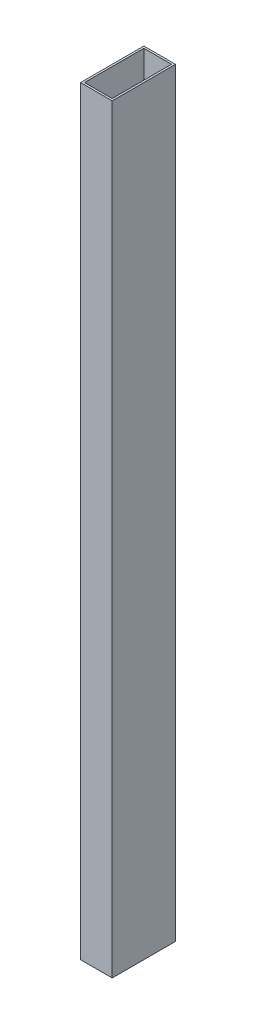
ISO-10303-21;
HEADER;
FILE_DESCRIPTION(('STEP AP214'),'2;1');
FILE_NAME('part.step','',(''),(''),'','','');
FILE_SCHEMA(('AUTOMOTIVE_DESIGN { 1 0 10303 214 1 1 1 1 }'));
ENDSEC;
DATA;
#1=APPLICATION_CONTEXT('core data for automotive mechanical design processes');
#2=APPLICATION_PROTOCOL_DEFINITION('international standard','automotive_design',2000,#1);
#3=PRODUCT_CONTEXT('',#1,'mechanical');
#4=PRODUCT('Part','Part','',(#3));
#5=PRODUCT_RELATED_PRODUCT_CATEGORY('part','',(#4));
#6=PRODUCT_DEFINITION_FORMATION('','',#4);
#7=PRODUCT_DEFINITION_CONTEXT('part definition',#1,'design');
#8=PRODUCT_DEFINITION('design','',#6,#7);
#9=PRODUCT_DEFINITION_SHAPE('','',#8);
#10=(LENGTH_UNIT() NAMED_UNIT(*) SI_UNIT(.MILLI.,.METRE.));
#11=(NAMED_UNIT(*) PLANE_ANGLE_UNIT() SI_UNIT($,.RADIAN.));
#12=(NAMED_UNIT(*) SI_UNIT($,.STERADIAN.) SOLID_ANGLE_UNIT());
#13=UNCERTAINTY_MEASURE_WITH_UNIT(LENGTH_MEASURE(1.E-05),#10,'distance_accuracy_value','');
#14=(GEOMETRIC_REPRESENTATION_CONTEXT(3) GLOBAL_UNCERTAINTY_ASSIGNED_CONTEXT((#13)) GLOBAL_UNIT_ASSIGNED_CONTEXT((#10,
#11,#12)) REPRESENTATION_CONTEXT('',''));
#15=CARTESIAN_POINT('',(0.,0.,0.));
#16=DIRECTION('',(0.,0.,1.));
#17=DIRECTION('',(1.,0.,0.));
#18=AXIS2_PLACEMENT_3D('',#15,#16,#17);
#19=CARTESIAN_POINT('',(0.,609.6,0.));
#20=DIRECTION('',(0.,1.,0.));
#21=DIRECTION('',(0.,0.,1.));
#22=AXIS2_PLACEMENT_3D('',#19,#20,#21);
#23=PLANE('',#22);
#24=DIRECTION('',(0.,0.,1.));
#25=VECTOR('',#24,1.);
#26=CARTESIAN_POINT('',(-12.7,609.6,25.4));
#27=LINE('',#26,#25);
#28=CARTESIAN_POINT('',(-12.7,609.6,-25.4));
#29=VERTEX_POINT('',#28);
#30=CARTESIAN_POINT('',(-12.7,609.6,25.4));
#31=VERTEX_POINT('',#30);
#32=EDGE_CURVE('E153',#29,#31,#27,.T.);
#33=ORIENTED_EDGE('',*,*,#32,.T.);
#34=DIRECTION('',(1.,0.,0.));
#35=VECTOR('',#34,1.);
#36=CARTESIAN_POINT('',(12.7,609.6,25.4));
#37=LINE('',#36,#35);
#38=CARTESIAN_POINT('',(12.7,609.6,25.4));
#39=VERTEX_POINT('',#38);
#40=EDGE_CURVE('E157',#31,#39,#37,.T.);
#41=ORIENTED_EDGE('',*,*,#40,.T.);
#42=DIRECTION('',(0.,0.,-1.));
#43=VECTOR('',#42,1.);
#44=CARTESIAN_POINT('',(12.7,609.6,25.4));
#45=LINE('',#44,#43);
#46=CARTESIAN_POINT('',(12.7,609.6,-25.4));
#47=VERTEX_POINT('',#46);
#48=EDGE_CURVE('E161',#39,#47,#45,.T.);
#49=ORIENTED_EDGE('',*,*,#48,.T.);
#50=DIRECTION('',(-1.,0.,0.));
#51=VECTOR('',#50,1.);
#52=CARTESIAN_POINT('',(12.7,609.6,-25.4));
#53=LINE('',#52,#51);
#54=EDGE_CURVE('E164',#47,#29,#53,.T.);
#55=ORIENTED_EDGE('',*,*,#54,.T.);
#56=EDGE_LOOP('',(#33,#41,#49,#55));
#57=FACE_BOUND('',#56,.T.);
#58=DIRECTION('',(1.,0.,0.));
#59=VECTOR('',#58,1.);
#60=CARTESIAN_POINT('',(11.1125,609.6,23.8125));
#61=LINE('',#60,#59);
#62=CARTESIAN_POINT('',(-11.1125,609.6,23.8125));
#63=VERTEX_POINT('',#62);
#64=CARTESIAN_POINT('',(11.1125,609.6,23.8125));
#65=VERTEX_POINT('',#64);
#66=EDGE_CURVE('E114',#63,#65,#61,.T.);
#67=ORIENTED_EDGE('',*,*,#66,.F.);
#68=DIRECTION('',(0.,0.,1.));
#69=VECTOR('',#68,1.);
#70=CARTESIAN_POINT('',(-11.1125,609.6,23.8125));
#71=LINE('',#70,#69);
#72=CARTESIAN_POINT('',(-11.1125,609.6,-23.8125));
#73=VERTEX_POINT('',#72);
#74=EDGE_CURVE('E105',#73,#63,#71,.T.);
#75=ORIENTED_EDGE('',*,*,#74,.F.);
#76=DIRECTION('',(-1.,0.,0.));
#77=VECTOR('',#76,1.);
#78=CARTESIAN_POINT('',(11.1125,609.6,-23.8125));
#79=LINE('',#78,#77);
#80=CARTESIAN_POINT('',(11.1125,609.6,-23.8125));
#81=VERTEX_POINT('',#80);
#82=EDGE_CURVE('E131',#81,#73,#79,.T.);
#83=ORIENTED_EDGE('',*,*,#82,.F.);
#84=DIRECTION('',(0.,0.,-1.));
#85=VECTOR('',#84,1.);
#86=CARTESIAN_POINT('',(11.1125,609.6,23.8125));
#87=LINE('',#86,#85);
#88=EDGE_CURVE('E127',#65,#81,#87,.T.);
#89=ORIENTED_EDGE('',*,*,#88,.F.);
#90=EDGE_LOOP('',(#67,#75,#83,#89));
#91=FACE_BOUND('',#90,.T.);
#92=ADVANCED_FACE('F39',(#57,#91),#23,.T.);
#93=CARTESIAN_POINT('',(0.,0.,0.));
#94=DIRECTION('',(0.,1.,0.));
#95=DIRECTION('',(0.,0.,1.));
#96=AXIS2_PLACEMENT_3D('',#93,#94,#95);
#97=PLANE('',#96);
#98=DIRECTION('',(0.,0.,1.));
#99=VECTOR('',#98,1.);
#100=CARTESIAN_POINT('',(-12.7,0.,25.4));
#101=LINE('',#100,#99);
#102=CARTESIAN_POINT('',(-12.7,0.,-25.4));
#103=VERTEX_POINT('',#102);
#104=CARTESIAN_POINT('',(-12.7,0.,25.4));
#105=VERTEX_POINT('',#104);
#106=EDGE_CURVE('E123',#103,#105,#101,.T.);
#107=ORIENTED_EDGE('',*,*,#106,.F.);
#108=DIRECTION('',(-1.,0.,0.));
#109=VECTOR('',#108,1.);
#110=CARTESIAN_POINT('',(12.7,0.,-25.4));
#111=LINE('',#110,#109);
#112=CARTESIAN_POINT('',(12.7,0.,-25.4));
#113=VERTEX_POINT('',#112);
#114=EDGE_CURVE('E158',#113,#103,#111,.T.);
#115=ORIENTED_EDGE('',*,*,#114,.F.);
#116=DIRECTION('',(0.,0.,-1.));
#117=VECTOR('',#116,1.);
#118=CARTESIAN_POINT('',(12.7,0.,25.4));
#119=LINE('',#118,#117);
#120=CARTESIAN_POINT('',(12.7,0.,25.4));
#121=VERTEX_POINT('',#120);
#122=EDGE_CURVE('E174',#121,#113,#119,.T.);
#123=ORIENTED_EDGE('',*,*,#122,.F.);
#124=DIRECTION('',(1.,0.,0.));
#125=VECTOR('',#124,1.);
#126=CARTESIAN_POINT('',(12.7,0.,25.4));
#127=LINE('',#126,#125);
#128=EDGE_CURVE('E171',#105,#121,#127,.T.);
#129=ORIENTED_EDGE('',*,*,#128,.F.);
#130=EDGE_LOOP('',(#107,#115,#123,#129));
#131=FACE_BOUND('',#130,.T.);
#132=DIRECTION('',(0.,0.,1.));
#133=VECTOR('',#132,1.);
#134=CARTESIAN_POINT('',(-11.1125,0.,23.8125));
#135=LINE('',#134,#133);
#136=CARTESIAN_POINT('',(-11.1125,0.,-23.8125));
#137=VERTEX_POINT('',#136);
#138=CARTESIAN_POINT('',(-11.1125,0.,23.8125));
#139=VERTEX_POINT('',#138);
#140=EDGE_CURVE('E63',#137,#139,#135,.T.);
#141=ORIENTED_EDGE('',*,*,#140,.T.);
#142=DIRECTION('',(1.,0.,0.));
#143=VECTOR('',#142,1.);
#144=CARTESIAN_POINT('',(11.1125,0.,23.8125));
#145=LINE('',#144,#143);
#146=CARTESIAN_POINT('',(11.1125,0.,23.8125));
#147=VERTEX_POINT('',#146);
#148=EDGE_CURVE('E121',#139,#147,#145,.T.);
#149=ORIENTED_EDGE('',*,*,#148,.T.);
#150=DIRECTION('',(0.,0.,-1.));
#151=VECTOR('',#150,1.);
#152=CARTESIAN_POINT('',(11.1125,0.,23.8125));
#153=LINE('',#152,#151);
#154=CARTESIAN_POINT('',(11.1125,0.,-23.8125));
#155=VERTEX_POINT('',#154);
#156=EDGE_CURVE('E140',#147,#155,#153,.T.);
#157=ORIENTED_EDGE('',*,*,#156,.T.);
#158=DIRECTION('',(-1.,0.,0.));
#159=VECTOR('',#158,1.);
#160=CARTESIAN_POINT('',(11.1125,0.,-23.8125));
#161=LINE('',#160,#159);
#162=EDGE_CURVE('E115',#155,#137,#161,.T.);
#163=ORIENTED_EDGE('',*,*,#162,.T.);
#164=EDGE_LOOP('',(#141,#149,#157,#163));
#165=FACE_BOUND('',#164,.T.);
#166=ADVANCED_FACE('F197',(#131,#165),#97,.F.);
#167=CARTESIAN_POINT('',(-12.7,609.6,25.4));
#168=DIRECTION('',(1.,0.,0.));
#169=DIRECTION('',(0.,0.,-1.));
#170=AXIS2_PLACEMENT_3D('',#167,#168,#169);
#171=PLANE('',#170);
#172=ORIENTED_EDGE('',*,*,#106,.T.);
#173=DIRECTION('',(0.,-1.,0.));
#174=VECTOR('',#173,1.);
#175=CARTESIAN_POINT('',(-12.7,609.6,25.4));
#176=LINE('',#175,#174);
#177=EDGE_CURVE('E11',#31,#105,#176,.T.);
#178=ORIENTED_EDGE('',*,*,#177,.F.);
#179=ORIENTED_EDGE('',*,*,#32,.F.);
#180=DIRECTION('',(0.,-1.,0.));
#181=VECTOR('',#180,1.);
#182=CARTESIAN_POINT('',(-12.7,609.6,-25.4));
#183=LINE('',#182,#181);
#184=EDGE_CURVE('E167',#29,#103,#183,.T.);
#185=ORIENTED_EDGE('',*,*,#184,.T.);
#186=EDGE_LOOP('',(#172,#178,#179,#185));
#187=FACE_BOUND('',#186,.T.);
#188=ADVANCED_FACE('F41',(#187),#171,.F.);
#189=CARTESIAN_POINT('',(12.7,609.6,25.4));
#190=DIRECTION('',(0.,0.,-1.));
#191=DIRECTION('',(-1.,0.,0.));
#192=AXIS2_PLACEMENT_3D('',#189,#190,#191);
#193=PLANE('',#192);
#194=ORIENTED_EDGE('',*,*,#128,.T.);
#195=DIRECTION('',(0.,-1.,0.));
#196=VECTOR('',#195,1.);
#197=CARTESIAN_POINT('',(12.7,609.6,25.4));
#198=LINE('',#197,#196);
#199=EDGE_CURVE('E48',#39,#121,#198,.T.);
#200=ORIENTED_EDGE('',*,*,#199,.F.);
#201=ORIENTED_EDGE('',*,*,#40,.F.);
#202=ORIENTED_EDGE('',*,*,#177,.T.);
#203=EDGE_LOOP('',(#194,#200,#201,#202));
#204=FACE_BOUND('',#203,.T.);
#205=ADVANCED_FACE('F207',(#204),#193,.F.);
#206=CARTESIAN_POINT('',(12.7,609.6,25.4));
#207=DIRECTION('',(-1.,0.,0.));
#208=DIRECTION('',(0.,0.,1.));
#209=AXIS2_PLACEMENT_3D('',#206,#207,#208);
#210=PLANE('',#209);
#211=ORIENTED_EDGE('',*,*,#122,.T.);
#212=DIRECTION('',(0.,-1.,0.));
#213=VECTOR('',#212,1.);
#214=CARTESIAN_POINT('',(12.7,609.6,-25.4));
#215=LINE('',#214,#213);
#216=EDGE_CURVE('E182',#47,#113,#215,.T.);
#217=ORIENTED_EDGE('',*,*,#216,.F.);
#218=ORIENTED_EDGE('',*,*,#48,.F.);
#219=ORIENTED_EDGE('',*,*,#199,.T.);
#220=EDGE_LOOP('',(#211,#217,#218,#219));
#221=FACE_BOUND('',#220,.T.);
#222=ADVANCED_FACE('F191',(#221),#210,.F.);
#223=CARTESIAN_POINT('',(12.7,609.6,-25.4));
#224=DIRECTION('',(0.,0.,1.));
#225=DIRECTION('',(1.,0.,0.));
#226=AXIS2_PLACEMENT_3D('',#223,#224,#225);
#227=PLANE('',#226);
#228=ORIENTED_EDGE('',*,*,#114,.T.);
#229=ORIENTED_EDGE('',*,*,#184,.F.);
#230=ORIENTED_EDGE('',*,*,#54,.F.);
#231=ORIENTED_EDGE('',*,*,#216,.T.);
#232=EDGE_LOOP('',(#228,#229,#230,#231));
#233=FACE_BOUND('',#232,.T.);
#234=ADVANCED_FACE('F201',(#233),#227,.F.);
#235=CARTESIAN_POINT('',(-11.1125,609.6,23.8125));
#236=DIRECTION('',(1.,0.,0.));
#237=DIRECTION('',(0.,0.,-1.));
#238=AXIS2_PLACEMENT_3D('',#235,#236,#237);
#239=PLANE('',#238);
#240=ORIENTED_EDGE('',*,*,#140,.F.);
#241=DIRECTION('',(0.,-1.,0.));
#242=VECTOR('',#241,1.);
#243=CARTESIAN_POINT('',(-11.1125,609.6,-23.8125));
#244=LINE('',#243,#242);
#245=EDGE_CURVE('E109',#73,#137,#244,.T.);
#246=ORIENTED_EDGE('',*,*,#245,.F.);
#247=ORIENTED_EDGE('',*,*,#74,.T.);
#248=DIRECTION('',(0.,-1.,0.));
#249=VECTOR('',#248,1.);
#250=CARTESIAN_POINT('',(-11.1125,609.6,23.8125));
#251=LINE('',#250,#249);
#252=EDGE_CURVE('E108',#63,#139,#251,.T.);
#253=ORIENTED_EDGE('',*,*,#252,.T.);
#254=EDGE_LOOP('',(#240,#246,#247,#253));
#255=FACE_BOUND('',#254,.T.);
#256=ADVANCED_FACE('F107',(#255),#239,.T.);
#257=CARTESIAN_POINT('',(11.1125,609.6,23.8125));
#258=DIRECTION('',(0.,0.,-1.));
#259=DIRECTION('',(-1.,0.,0.));
#260=AXIS2_PLACEMENT_3D('',#257,#258,#259);
#261=PLANE('',#260);
#262=ORIENTED_EDGE('',*,*,#148,.F.);
#263=ORIENTED_EDGE('',*,*,#252,.F.);
#264=ORIENTED_EDGE('',*,*,#66,.T.);
#265=DIRECTION('',(0.,-1.,0.));
#266=VECTOR('',#265,1.);
#267=CARTESIAN_POINT('',(11.1125,609.6,23.8125));
#268=LINE('',#267,#266);
#269=EDGE_CURVE('E124',#65,#147,#268,.T.);
#270=ORIENTED_EDGE('',*,*,#269,.T.);
#271=EDGE_LOOP('',(#262,#263,#264,#270));
#272=FACE_BOUND('',#271,.T.);
#273=ADVANCED_FACE('F118',(#272),#261,.T.);
#274=CARTESIAN_POINT('',(11.1125,609.6,23.8125));
#275=DIRECTION('',(-1.,0.,0.));
#276=DIRECTION('',(0.,0.,1.));
#277=AXIS2_PLACEMENT_3D('',#274,#275,#276);
#278=PLANE('',#277);
#279=ORIENTED_EDGE('',*,*,#156,.F.);
#280=ORIENTED_EDGE('',*,*,#269,.F.);
#281=ORIENTED_EDGE('',*,*,#88,.T.);
#282=DIRECTION('',(0.,-1.,0.));
#283=VECTOR('',#282,1.);
#284=CARTESIAN_POINT('',(11.1125,609.6,-23.8125));
#285=LINE('',#284,#283);
#286=EDGE_CURVE('E55',#81,#155,#285,.T.);
#287=ORIENTED_EDGE('',*,*,#286,.T.);
#288=EDGE_LOOP('',(#279,#280,#281,#287));
#289=FACE_BOUND('',#288,.T.);
#290=ADVANCED_FACE('F230',(#289),#278,.T.);
#291=CARTESIAN_POINT('',(11.1125,609.6,-23.8125));
#292=DIRECTION('',(0.,0.,1.));
#293=DIRECTION('',(1.,0.,0.));
#294=AXIS2_PLACEMENT_3D('',#291,#292,#293);
#295=PLANE('',#294);
#296=ORIENTED_EDGE('',*,*,#162,.F.);
#297=ORIENTED_EDGE('',*,*,#286,.F.);
#298=ORIENTED_EDGE('',*,*,#82,.T.);
#299=ORIENTED_EDGE('',*,*,#245,.T.);
#300=EDGE_LOOP('',(#296,#297,#298,#299));
#301=FACE_BOUND('',#300,.T.);
#302=ADVANCED_FACE('F234',(#301),#295,.T.);
#303=CLOSED_SHELL('',(#92,#166,#188,#205,#222,#234,#256,#273,#290,#302));
#304=MANIFOLD_SOLID_BREP('B2',#303);
#305=ADVANCED_BREP_SHAPE_REPRESENTATION('',(#18,#304),#14);
#306=SHAPE_DEFINITION_REPRESENTATION(#9,#305);
ENDSEC;
END-ISO-10303-21;
